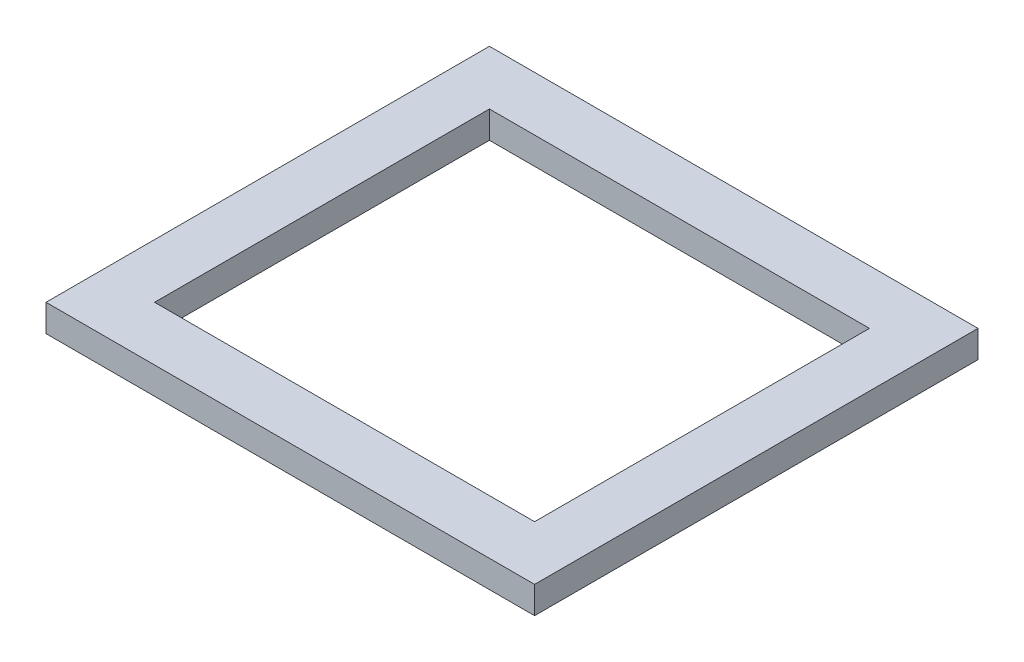
ISO-10303-21;
HEADER;
FILE_DESCRIPTION(('STEP AP214'),'2;1');
FILE_NAME('part.step','',(''),(''),'','','');
FILE_SCHEMA(('AUTOMOTIVE_DESIGN { 1 0 10303 214 1 1 1 1 }'));
ENDSEC;
DATA;
#1=APPLICATION_CONTEXT('core data for automotive mechanical design processes');
#2=APPLICATION_PROTOCOL_DEFINITION('international standard','automotive_design',2000,#1);
#3=PRODUCT_CONTEXT('',#1,'mechanical');
#4=PRODUCT('Part','Part','',(#3));
#5=PRODUCT_RELATED_PRODUCT_CATEGORY('part','',(#4));
#6=PRODUCT_DEFINITION_FORMATION('','',#4);
#7=PRODUCT_DEFINITION_CONTEXT('part definition',#1,'design');
#8=PRODUCT_DEFINITION('design','',#6,#7);
#9=PRODUCT_DEFINITION_SHAPE('','',#8);
#10=(LENGTH_UNIT() NAMED_UNIT(*) SI_UNIT(.MILLI.,.METRE.));
#11=(NAMED_UNIT(*) PLANE_ANGLE_UNIT() SI_UNIT($,.RADIAN.));
#12=(NAMED_UNIT(*) SI_UNIT($,.STERADIAN.) SOLID_ANGLE_UNIT());
#13=UNCERTAINTY_MEASURE_WITH_UNIT(LENGTH_MEASURE(1.E-05),#10,'distance_accuracy_value','');
#14=(GEOMETRIC_REPRESENTATION_CONTEXT(3) GLOBAL_UNCERTAINTY_ASSIGNED_CONTEXT((#13)) GLOBAL_UNIT_ASSIGNED_CONTEXT((#10,
#11,#12)) REPRESENTATION_CONTEXT('',''));
#15=CARTESIAN_POINT('',(0.,0.,0.));
#16=DIRECTION('',(0.,0.,1.));
#17=DIRECTION('',(1.,0.,0.));
#18=AXIS2_PLACEMENT_3D('',#15,#16,#17);
#19=CARTESIAN_POINT('',(0.,3.175,0.));
#20=DIRECTION('',(0.,1.,0.));
#21=DIRECTION('',(0.,0.,1.));
#22=AXIS2_PLACEMENT_3D('',#19,#20,#21);
#23=PLANE('',#22);
#24=DIRECTION('',(0.,0.,1.));
#25=VECTOR('',#24,1.);
#26=CARTESIAN_POINT('',(-6.35,3.175,-45.5168));
#27=LINE('',#26,#25);
#28=CARTESIAN_POINT('',(-6.35,3.175,-45.5168));
#29=VERTEX_POINT('',#28);
#30=CARTESIAN_POINT('',(-6.34999999999999,3.175,6.35));
#31=VERTEX_POINT('',#30);
#32=EDGE_CURVE('E134',#29,#31,#27,.T.);
#33=ORIENTED_EDGE('',*,*,#32,.T.);
#34=DIRECTION('',(1.,0.,0.));
#35=VECTOR('',#34,1.);
#36=CARTESIAN_POINT('',(-6.34999999999999,3.175,6.35));
#37=LINE('',#36,#35);
#38=CARTESIAN_POINT('',(50.8,3.175,6.35));
#39=VERTEX_POINT('',#38);
#40=EDGE_CURVE('E137',#31,#39,#37,.T.);
#41=ORIENTED_EDGE('',*,*,#40,.T.);
#42=DIRECTION('',(0.,0.,-1.));
#43=VECTOR('',#42,1.);
#44=CARTESIAN_POINT('',(50.8,3.175,-45.5168));
#45=LINE('',#44,#43);
#46=CARTESIAN_POINT('',(50.8,3.175,-45.5168));
#47=VERTEX_POINT('',#46);
#48=EDGE_CURVE('E140',#39,#47,#45,.T.);
#49=ORIENTED_EDGE('',*,*,#48,.T.);
#50=DIRECTION('',(-1.,0.,0.));
#51=VECTOR('',#50,1.);
#52=CARTESIAN_POINT('',(-6.35,3.175,-45.5168));
#53=LINE('',#52,#51);
#54=EDGE_CURVE('E142',#47,#29,#53,.T.);
#55=ORIENTED_EDGE('',*,*,#54,.T.);
#56=EDGE_LOOP('',(#33,#41,#49,#55));
#57=FACE_BOUND('',#56,.T.);
#58=DIRECTION('',(1.,0.,0.));
#59=VECTOR('',#58,1.);
#60=CARTESIAN_POINT('',(0.,3.175,0.));
#61=LINE('',#60,#59);
#62=CARTESIAN_POINT('',(0.,3.175,0.));
#63=VERTEX_POINT('',#62);
#64=CARTESIAN_POINT('',(44.45,3.175,0.));
#65=VERTEX_POINT('',#64);
#66=EDGE_CURVE('E106',#63,#65,#61,.T.);
#67=ORIENTED_EDGE('',*,*,#66,.F.);
#68=DIRECTION('',(0.,0.,1.));
#69=VECTOR('',#68,1.);
#70=CARTESIAN_POINT('',(0.,3.175,0.));
#71=LINE('',#70,#69);
#72=CARTESIAN_POINT('',(0.,3.175,-39.1668));
#73=VERTEX_POINT('',#72);
#74=EDGE_CURVE('E98',#73,#63,#71,.T.);
#75=ORIENTED_EDGE('',*,*,#74,.F.);
#76=DIRECTION('',(-1.,0.,0.));
#77=VECTOR('',#76,1.);
#78=CARTESIAN_POINT('',(0.,3.175,-39.1668));
#79=LINE('',#78,#77);
#80=CARTESIAN_POINT('',(44.45,3.175,-39.1668));
#81=VERTEX_POINT('',#80);
#82=EDGE_CURVE('E120',#81,#73,#79,.T.);
#83=ORIENTED_EDGE('',*,*,#82,.F.);
#84=DIRECTION('',(0.,0.,-1.));
#85=VECTOR('',#84,1.);
#86=CARTESIAN_POINT('',(44.45,3.175,0.));
#87=LINE('',#86,#85);
#88=EDGE_CURVE('E118',#65,#81,#87,.T.);
#89=ORIENTED_EDGE('',*,*,#88,.F.);
#90=EDGE_LOOP('',(#67,#75,#83,#89));
#91=FACE_BOUND('',#90,.T.);
#92=ADVANCED_FACE('F33',(#57,#91),#23,.T.);
#93=CARTESIAN_POINT('',(0.,0.,0.));
#94=DIRECTION('',(0.,1.,0.));
#95=DIRECTION('',(0.,0.,1.));
#96=AXIS2_PLACEMENT_3D('',#93,#94,#95);
#97=PLANE('',#96);
#98=DIRECTION('',(0.,0.,1.));
#99=VECTOR('',#98,1.);
#100=CARTESIAN_POINT('',(-6.35,0.,-45.5168));
#101=LINE('',#100,#99);
#102=CARTESIAN_POINT('',(-6.35,0.,-45.5168));
#103=VERTEX_POINT('',#102);
#104=CARTESIAN_POINT('',(-6.34999999999999,0.,6.35));
#105=VERTEX_POINT('',#104);
#106=EDGE_CURVE('E114',#103,#105,#101,.T.);
#107=ORIENTED_EDGE('',*,*,#106,.F.);
#108=DIRECTION('',(-1.,0.,0.));
#109=VECTOR('',#108,1.);
#110=CARTESIAN_POINT('',(-6.35,0.,-45.5168));
#111=LINE('',#110,#109);
#112=CARTESIAN_POINT('',(50.8,0.,-45.5168));
#113=VERTEX_POINT('',#112);
#114=EDGE_CURVE('E138',#113,#103,#111,.T.);
#115=ORIENTED_EDGE('',*,*,#114,.F.);
#116=DIRECTION('',(0.,0.,-1.));
#117=VECTOR('',#116,1.);
#118=CARTESIAN_POINT('',(50.8,0.,-45.5168));
#119=LINE('',#118,#117);
#120=CARTESIAN_POINT('',(50.8,0.,6.35));
#121=VERTEX_POINT('',#120);
#122=EDGE_CURVE('E149',#121,#113,#119,.T.);
#123=ORIENTED_EDGE('',*,*,#122,.F.);
#124=DIRECTION('',(1.,0.,0.));
#125=VECTOR('',#124,1.);
#126=CARTESIAN_POINT('',(-6.34999999999999,0.,6.35));
#127=LINE('',#126,#125);
#128=EDGE_CURVE('E147',#105,#121,#127,.T.);
#129=ORIENTED_EDGE('',*,*,#128,.F.);
#130=EDGE_LOOP('',(#107,#115,#123,#129));
#131=FACE_BOUND('',#130,.T.);
#132=DIRECTION('',(0.,0.,1.));
#133=VECTOR('',#132,1.);
#134=CARTESIAN_POINT('',(0.,0.,0.));
#135=LINE('',#134,#133);
#136=CARTESIAN_POINT('',(0.,0.,-39.1668));
#137=VERTEX_POINT('',#136);
#138=CARTESIAN_POINT('',(0.,0.,0.));
#139=VERTEX_POINT('',#138);
#140=EDGE_CURVE('E56',#137,#139,#135,.T.);
#141=ORIENTED_EDGE('',*,*,#140,.T.);
#142=DIRECTION('',(1.,0.,0.));
#143=VECTOR('',#142,1.);
#144=CARTESIAN_POINT('',(0.,0.,0.));
#145=LINE('',#144,#143);
#146=CARTESIAN_POINT('',(44.45,0.,0.));
#147=VERTEX_POINT('',#146);
#148=EDGE_CURVE('E113',#139,#147,#145,.T.);
#149=ORIENTED_EDGE('',*,*,#148,.T.);
#150=DIRECTION('',(0.,0.,-1.));
#151=VECTOR('',#150,1.);
#152=CARTESIAN_POINT('',(44.45,0.,0.));
#153=LINE('',#152,#151);
#154=CARTESIAN_POINT('',(44.45,0.,-39.1668));
#155=VERTEX_POINT('',#154);
#156=EDGE_CURVE('E126',#147,#155,#153,.T.);
#157=ORIENTED_EDGE('',*,*,#156,.T.);
#158=DIRECTION('',(-1.,0.,0.));
#159=VECTOR('',#158,1.);
#160=CARTESIAN_POINT('',(0.,0.,-39.1668));
#161=LINE('',#160,#159);
#162=EDGE_CURVE('E107',#155,#137,#161,.T.);
#163=ORIENTED_EDGE('',*,*,#162,.T.);
#164=EDGE_LOOP('',(#141,#149,#157,#163));
#165=FACE_BOUND('',#164,.T.);
#166=ADVANCED_FACE('F167',(#131,#165),#97,.F.);
#167=CARTESIAN_POINT('',(-6.35,3.175,-45.5168));
#168=DIRECTION('',(1.,0.,0.));
#169=DIRECTION('',(0.,0.,-1.));
#170=AXIS2_PLACEMENT_3D('',#167,#168,#169);
#171=PLANE('',#170);
#172=ORIENTED_EDGE('',*,*,#106,.T.);
#173=DIRECTION('',(0.,-1.,0.));
#174=VECTOR('',#173,1.);
#175=CARTESIAN_POINT('',(-6.34999999999999,3.175,6.35));
#176=LINE('',#175,#174);
#177=EDGE_CURVE('E11',#31,#105,#176,.T.);
#178=ORIENTED_EDGE('',*,*,#177,.F.);
#179=ORIENTED_EDGE('',*,*,#32,.F.);
#180=DIRECTION('',(0.,-1.,0.));
#181=VECTOR('',#180,1.);
#182=CARTESIAN_POINT('',(-6.35,3.175,-45.5168));
#183=LINE('',#182,#181);
#184=EDGE_CURVE('E144',#29,#103,#183,.T.);
#185=ORIENTED_EDGE('',*,*,#184,.T.);
#186=EDGE_LOOP('',(#172,#178,#179,#185));
#187=FACE_BOUND('',#186,.T.);
#188=ADVANCED_FACE('F35',(#187),#171,.F.);
#189=CARTESIAN_POINT('',(-6.34999999999999,3.175,6.35));
#190=DIRECTION('',(0.,0.,-1.));
#191=DIRECTION('',(-1.,0.,0.));
#192=AXIS2_PLACEMENT_3D('',#189,#190,#191);
#193=PLANE('',#192);
#194=ORIENTED_EDGE('',*,*,#128,.T.);
#195=DIRECTION('',(0.,-1.,0.));
#196=VECTOR('',#195,1.);
#197=CARTESIAN_POINT('',(50.8,3.175,6.35));
#198=LINE('',#197,#196);
#199=EDGE_CURVE('E41',#39,#121,#198,.T.);
#200=ORIENTED_EDGE('',*,*,#199,.F.);
#201=ORIENTED_EDGE('',*,*,#40,.F.);
#202=ORIENTED_EDGE('',*,*,#177,.T.);
#203=EDGE_LOOP('',(#194,#200,#201,#202));
#204=FACE_BOUND('',#203,.T.);
#205=ADVANCED_FACE('F177',(#204),#193,.F.);
#206=CARTESIAN_POINT('',(50.8,3.175,-45.5168));
#207=DIRECTION('',(-1.,0.,0.));
#208=DIRECTION('',(0.,0.,1.));
#209=AXIS2_PLACEMENT_3D('',#206,#207,#208);
#210=PLANE('',#209);
#211=ORIENTED_EDGE('',*,*,#122,.T.);
#212=DIRECTION('',(0.,-1.,0.));
#213=VECTOR('',#212,1.);
#214=CARTESIAN_POINT('',(50.8,3.175,-45.5168));
#215=LINE('',#214,#213);
#216=EDGE_CURVE('E154',#47,#113,#215,.T.);
#217=ORIENTED_EDGE('',*,*,#216,.F.);
#218=ORIENTED_EDGE('',*,*,#48,.F.);
#219=ORIENTED_EDGE('',*,*,#199,.T.);
#220=EDGE_LOOP('',(#211,#217,#218,#219));
#221=FACE_BOUND('',#220,.T.);
#222=ADVANCED_FACE('F161',(#221),#210,.F.);
#223=CARTESIAN_POINT('',(-6.35,3.175,-45.5168));
#224=DIRECTION('',(0.,0.,1.));
#225=DIRECTION('',(1.,0.,0.));
#226=AXIS2_PLACEMENT_3D('',#223,#224,#225);
#227=PLANE('',#226);
#228=ORIENTED_EDGE('',*,*,#114,.T.);
#229=ORIENTED_EDGE('',*,*,#184,.F.);
#230=ORIENTED_EDGE('',*,*,#54,.F.);
#231=ORIENTED_EDGE('',*,*,#216,.T.);
#232=EDGE_LOOP('',(#228,#229,#230,#231));
#233=FACE_BOUND('',#232,.T.);
#234=ADVANCED_FACE('F171',(#233),#227,.F.);
#235=CARTESIAN_POINT('',(0.,3.175,0.));
#236=DIRECTION('',(1.,0.,0.));
#237=DIRECTION('',(0.,0.,-1.));
#238=AXIS2_PLACEMENT_3D('',#235,#236,#237);
#239=PLANE('',#238);
#240=ORIENTED_EDGE('',*,*,#140,.F.);
#241=DIRECTION('',(0.,-1.,0.));
#242=VECTOR('',#241,1.);
#243=CARTESIAN_POINT('',(0.,3.175,-39.1668));
#244=LINE('',#243,#242);
#245=EDGE_CURVE('E102',#73,#137,#244,.T.);
#246=ORIENTED_EDGE('',*,*,#245,.F.);
#247=ORIENTED_EDGE('',*,*,#74,.T.);
#248=DIRECTION('',(0.,-1.,0.));
#249=VECTOR('',#248,1.);
#250=CARTESIAN_POINT('',(0.,3.175,0.));
#251=LINE('',#250,#249);
#252=EDGE_CURVE('E101',#63,#139,#251,.T.);
#253=ORIENTED_EDGE('',*,*,#252,.T.);
#254=EDGE_LOOP('',(#240,#246,#247,#253));
#255=FACE_BOUND('',#254,.T.);
#256=ADVANCED_FACE('F100',(#255),#239,.T.);
#257=CARTESIAN_POINT('',(0.,3.175,0.));
#258=DIRECTION('',(0.,0.,-1.));
#259=DIRECTION('',(-1.,0.,0.));
#260=AXIS2_PLACEMENT_3D('',#257,#258,#259);
#261=PLANE('',#260);
#262=ORIENTED_EDGE('',*,*,#148,.F.);
#263=ORIENTED_EDGE('',*,*,#252,.F.);
#264=ORIENTED_EDGE('',*,*,#66,.T.);
#265=DIRECTION('',(0.,-1.,0.));
#266=VECTOR('',#265,1.);
#267=CARTESIAN_POINT('',(44.45,3.175,0.));
#268=LINE('',#267,#266);
#269=EDGE_CURVE('E115',#65,#147,#268,.T.);
#270=ORIENTED_EDGE('',*,*,#269,.T.);
#271=EDGE_LOOP('',(#262,#263,#264,#270));
#272=FACE_BOUND('',#271,.T.);
#273=ADVANCED_FACE('F110',(#272),#261,.T.);
#274=CARTESIAN_POINT('',(44.45,3.175,0.));
#275=DIRECTION('',(-1.,0.,0.));
#276=DIRECTION('',(0.,0.,1.));
#277=AXIS2_PLACEMENT_3D('',#274,#275,#276);
#278=PLANE('',#277);
#279=ORIENTED_EDGE('',*,*,#156,.F.);
#280=ORIENTED_EDGE('',*,*,#269,.F.);
#281=ORIENTED_EDGE('',*,*,#88,.T.);
#282=DIRECTION('',(0.,-1.,0.));
#283=VECTOR('',#282,1.);
#284=CARTESIAN_POINT('',(44.45,3.175,-39.1668));
#285=LINE('',#284,#283);
#286=EDGE_CURVE('E48',#81,#155,#285,.T.);
#287=ORIENTED_EDGE('',*,*,#286,.T.);
#288=EDGE_LOOP('',(#279,#280,#281,#287));
#289=FACE_BOUND('',#288,.T.);
#290=ADVANCED_FACE('F200',(#289),#278,.T.);
#291=CARTESIAN_POINT('',(0.,3.175,-39.1668));
#292=DIRECTION('',(0.,0.,1.));
#293=DIRECTION('',(1.,0.,0.));
#294=AXIS2_PLACEMENT_3D('',#291,#292,#293);
#295=PLANE('',#294);
#296=ORIENTED_EDGE('',*,*,#162,.F.);
#297=ORIENTED_EDGE('',*,*,#286,.F.);
#298=ORIENTED_EDGE('',*,*,#82,.T.);
#299=ORIENTED_EDGE('',*,*,#245,.T.);
#300=EDGE_LOOP('',(#296,#297,#298,#299));
#301=FACE_BOUND('',#300,.T.);
#302=ADVANCED_FACE('F204',(#301),#295,.T.);
#303=CLOSED_SHELL('',(#92,#166,#188,#205,#222,#234,#256,#273,#290,#302));
#304=MANIFOLD_SOLID_BREP('B2',#303);
#305=ADVANCED_BREP_SHAPE_REPRESENTATION('',(#18,#304),#14);
#306=SHAPE_DEFINITION_REPRESENTATION(#9,#305);
ENDSEC;
END-ISO-10303-21;
